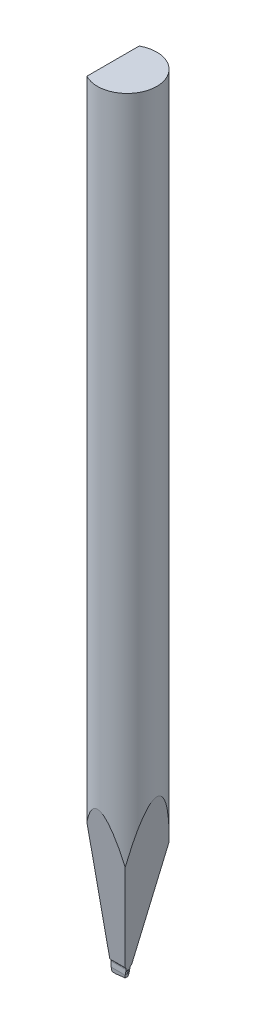
ISO-10303-21;
HEADER;
FILE_DESCRIPTION(('STEP AP214'),'2;1');
FILE_NAME('part.step','',(''),(''),'','','');
FILE_SCHEMA(('AUTOMOTIVE_DESIGN { 1 0 10303 214 1 1 1 1 }'));
ENDSEC;
DATA;
#1=APPLICATION_CONTEXT('core data for automotive mechanical design processes');
#2=APPLICATION_PROTOCOL_DEFINITION('international standard','automotive_design',2000,#1);
#3=PRODUCT_CONTEXT('',#1,'mechanical');
#4=PRODUCT('Part','Part','',(#3));
#5=PRODUCT_RELATED_PRODUCT_CATEGORY('part','',(#4));
#6=PRODUCT_DEFINITION_FORMATION('','',#4);
#7=PRODUCT_DEFINITION_CONTEXT('part definition',#1,'design');
#8=PRODUCT_DEFINITION('design','',#6,#7);
#9=PRODUCT_DEFINITION_SHAPE('','',#8);
#10=(LENGTH_UNIT() NAMED_UNIT(*) SI_UNIT(.MILLI.,.METRE.));
#11=(NAMED_UNIT(*) PLANE_ANGLE_UNIT() SI_UNIT($,.RADIAN.));
#12=(NAMED_UNIT(*) SI_UNIT($,.STERADIAN.) SOLID_ANGLE_UNIT());
#13=UNCERTAINTY_MEASURE_WITH_UNIT(LENGTH_MEASURE(1.E-05),#10,'distance_accuracy_value','');
#14=(GEOMETRIC_REPRESENTATION_CONTEXT(3) GLOBAL_UNCERTAINTY_ASSIGNED_CONTEXT((#13)) GLOBAL_UNIT_ASSIGNED_CONTEXT((#10,
#11,#12)) REPRESENTATION_CONTEXT('',''));
#15=CARTESIAN_POINT('',(0.,0.,0.));
#16=DIRECTION('',(0.,0.,1.));
#17=DIRECTION('',(1.,0.,0.));
#18=AXIS2_PLACEMENT_3D('',#15,#16,#17);
#19=CARTESIAN_POINT('',(26.8738719491216,0.,0.03048));
#20=DIRECTION('',(0.,-0.173648177666931,0.984807753012208));
#21=DIRECTION('',(0.,-0.984807753012208,-0.173648177666931));
#22=AXIS2_PLACEMENT_3D('',#19,#20,#21);
#23=PLANE('',#22);
#24=CARTESIAN_POINT('',(-0.34798,0.02794,0.0354065758409947));
#25=DIRECTION('',(0.,-0.173648177666931,0.984807753012208));
#26=DIRECTION('',(0.,-0.984807753012208,-0.173648177666931));
#27=AXIS2_PLACEMENT_3D('',#24,#25,#26);
#28=ELLIPSE('',#27,0.0283710195360877,0.02794);
#29=CARTESIAN_POINT('',(-0.352440322188275,0.000358319014665188,0.0305431813099863));
#30=VERTEX_POINT('',#29);
#31=CARTESIAN_POINT('',(-0.37592,0.02794,0.0354065758409947));
#32=VERTEX_POINT('',#31);
#33=EDGE_CURVE('E231',#30,#32,#28,.F.);
#34=ORIENTED_EDGE('',*,*,#33,.F.);
#35=DIRECTION('',(-1.,0.,0.));
#36=VECTOR('',#35,1.);
#37=CARTESIAN_POINT('',(26.7468719491216,0.000358319014665188,0.0305431813099863));
#38=LINE('',#37,#36);
#39=CARTESIAN_POINT('',(-0.27177042773209,0.000358319014666895,0.0305431813099866));
#40=VERTEX_POINT('',#39);
#41=EDGE_CURVE('E230',#40,#30,#38,.T.);
#42=ORIENTED_EDGE('',*,*,#41,.F.);
#43=DIRECTION('',(-0.98997002855162,-0.139131214142995,-0.0245325869121374));
#44=VECTOR('',#43,1.);
#45=CARTESIAN_POINT('',(26.3320118858664,3.73927609160853,0.689815263268684));
#46=LINE('',#45,#44);
#47=CARTESIAN_POINT('',(-0.0138656438636747,0.0366044726132731,0.0369343561363241));
#48=VERTEX_POINT('',#47);
#49=EDGE_CURVE('E390',#48,#40,#46,.T.);
#50=ORIENTED_EDGE('',*,*,#49,.F.);
#51=DIRECTION('',(-0.171087869746036,-0.970287525247814,-0.171087869746036));
#52=VECTOR('',#51,1.);
#53=CARTESIAN_POINT('',(0.766901483986015,4.46455489014234,0.817701483986016));
#54=LINE('',#53,#52);
#55=CARTESIAN_POINT('',(0.,0.115240446574631,0.0508));
#56=VERTEX_POINT('',#55);
#57=EDGE_CURVE('E377',#56,#48,#54,.T.);
#58=ORIENTED_EDGE('',*,*,#57,.F.);
#59=DIRECTION('',(-1.,0.,0.));
#60=VECTOR('',#59,1.);
#61=CARTESIAN_POINT('',(26.8738719491216,0.115240446574631,0.0508));
#62=LINE('',#61,#60);
#63=CARTESIAN_POINT('',(-0.375919999999998,0.115240446574631,0.0508));
#64=VERTEX_POINT('',#63);
#65=EDGE_CURVE('E284',#56,#64,#62,.T.);
#66=ORIENTED_EDGE('',*,*,#65,.T.);
#67=DIRECTION('',(0.,0.984807753012208,0.173648177666931));
#68=VECTOR('',#67,1.);
#69=CARTESIAN_POINT('',(-0.37592,20.2545871772642,3.60191020246341));
#70=LINE('',#69,#68);
#71=EDGE_CURVE('E54',#32,#64,#70,.T.);
#72=ORIENTED_EDGE('',*,*,#71,.F.);
#73=EDGE_LOOP('',(#34,#42,#50,#58,#66,#72));
#74=FACE_BOUND('',#73,.T.);
#75=ADVANCED_FACE('F46',(#74),#23,.T.);
#76=CARTESIAN_POINT('',(26.8738719491216,0.,-0.03048));
#77=DIRECTION('',(0.,-0.173648177666931,-0.984807753012208));
#78=DIRECTION('',(0.,0.984807753012208,-0.173648177666931));
#79=AXIS2_PLACEMENT_3D('',#76,#77,#78);
#80=PLANE('',#79);
#81=CARTESIAN_POINT('',(-0.34798,0.02794,-0.0354065758409947));
#82=DIRECTION('',(0.,-0.173648177666931,-0.984807753012208));
#83=DIRECTION('',(0.,0.984807753012208,-0.173648177666931));
#84=AXIS2_PLACEMENT_3D('',#81,#82,#83);
#85=ELLIPSE('',#84,0.0283710195360877,0.02794);
#86=CARTESIAN_POINT('',(-0.37592,0.02794,-0.0354065758409947));
#87=VERTEX_POINT('',#86);
#88=CARTESIAN_POINT('',(-0.352440322188275,0.000358319014665188,-0.0305431813099863));
#89=VERTEX_POINT('',#88);
#90=EDGE_CURVE('E609',#87,#89,#85,.F.);
#91=ORIENTED_EDGE('',*,*,#90,.F.);
#92=DIRECTION('',(0.,-0.984807753012208,0.173648177666931));
#93=VECTOR('',#92,1.);
#94=CARTESIAN_POINT('',(-0.37592,20.5290514950398,-3.65030566692899));
#95=LINE('',#94,#93);
#96=CARTESIAN_POINT('',(-0.375919999999998,0.115240446574631,-0.0508));
#97=VERTEX_POINT('',#96);
#98=EDGE_CURVE('E264',#97,#87,#95,.T.);
#99=ORIENTED_EDGE('',*,*,#98,.F.);
#100=DIRECTION('',(1.,0.,0.));
#101=VECTOR('',#100,1.);
#102=CARTESIAN_POINT('',(26.8738719491216,0.115240446574631,-0.0508));
#103=LINE('',#102,#101);
#104=CARTESIAN_POINT('',(0.,0.115240446574631,-0.0508));
#105=VERTEX_POINT('',#104);
#106=EDGE_CURVE('E273',#97,#105,#103,.T.);
#107=ORIENTED_EDGE('',*,*,#106,.T.);
#108=DIRECTION('',(0.171087869746036,0.970287525247814,-0.171087869746036));
#109=VECTOR('',#108,1.);
#110=CARTESIAN_POINT('',(0.766901483986015,4.46455489014234,-0.817701483986016));
#111=LINE('',#110,#109);
#112=CARTESIAN_POINT('',(-0.0138656438636747,0.0366044726132731,-0.0369343561363241));
#113=VERTEX_POINT('',#112);
#114=EDGE_CURVE('E388',#113,#105,#111,.T.);
#115=ORIENTED_EDGE('',*,*,#114,.F.);
#116=DIRECTION('',(0.98997002855162,0.139131214142995,-0.0245325869121374));
#117=VECTOR('',#116,1.);
#118=CARTESIAN_POINT('',(26.3320118858664,3.73927609160853,-0.689815263268684));
#119=LINE('',#118,#117);
#120=CARTESIAN_POINT('',(-0.27177042773209,0.000358319014666895,-0.0305431813099866));
#121=VERTEX_POINT('',#120);
#122=EDGE_CURVE('E296',#121,#113,#119,.T.);
#123=ORIENTED_EDGE('',*,*,#122,.F.);
#124=DIRECTION('',(-1.,0.,0.));
#125=VECTOR('',#124,1.);
#126=CARTESIAN_POINT('',(26.7468719491216,0.000358319014665188,-0.0305431813099863));
#127=LINE('',#126,#125);
#128=EDGE_CURVE('E256',#89,#121,#127,.F.);
#129=ORIENTED_EDGE('',*,*,#128,.F.);
#130=EDGE_LOOP('',(#91,#99,#107,#115,#123,#129));
#131=FACE_BOUND('',#130,.T.);
#132=ADVANCED_FACE('F471',(#131),#80,.T.);
#133=CARTESIAN_POINT('',(-0.27432,0.,26.5130490073722));
#134=DIRECTION('',(-0.139173100960066,0.99026806874157,0.));
#135=DIRECTION('',(-0.99026806874157,-0.139173100960066,0.));
#136=AXIS2_PLACEMENT_3D('',#133,#134,#135);
#137=PLANE('',#136);
#138=DIRECTION('',(-0.99026806874157,-0.139173100960066,0.));
#139=VECTOR('',#138,1.);
#140=CARTESIAN_POINT('',(-0.27432,0.,0.0190499999999996));
#141=LINE('',#140,#139);
#142=CARTESIAN_POINT('',(-0.13716,0.0192765808877801,0.0190499999999998));
#143=VERTEX_POINT('',#142);
#144=CARTESIAN_POINT('',(-0.261173150528052,0.00184766919849458,0.01905));
#145=VERTEX_POINT('',#144);
#146=EDGE_CURVE('E305',#143,#145,#141,.T.);
#147=ORIENTED_EDGE('',*,*,#146,.F.);
#148=DIRECTION('',(0.,0.,1.));
#149=VECTOR('',#148,1.);
#150=CARTESIAN_POINT('',(-0.13716,0.0192765808877801,26.5130490073722));
#151=LINE('',#150,#149);
#152=CARTESIAN_POINT('',(-0.13716,0.0192765808877801,-0.0190499999999998));
#153=VERTEX_POINT('',#152);
#154=EDGE_CURVE('E306',#153,#143,#151,.T.);
#155=ORIENTED_EDGE('',*,*,#154,.F.);
#156=DIRECTION('',(-0.99026806874157,-0.139173100960066,0.));
#157=VECTOR('',#156,1.);
#158=CARTESIAN_POINT('',(-0.27432,0.,-0.0190499999999996));
#159=LINE('',#158,#157);
#160=CARTESIAN_POINT('',(-0.261173150528052,0.00184766919849458,-0.01905));
#161=VERTEX_POINT('',#160);
#162=EDGE_CURVE('E636',#153,#161,#159,.T.);
#163=ORIENTED_EDGE('',*,*,#162,.T.);
#164=CARTESIAN_POINT('',(-1.62801954506725,-0.190250064,0.));
#165=DIRECTION('',(-0.139173100960066,0.99026806874157,0.));
#166=DIRECTION('',(-0.99026806874157,-0.139173100960066,0.));
#167=AXIS2_PLACEMENT_3D('',#164,#165,#166);
#168=ELLIPSE('',#167,1.38704964298662,0.19304);
#169=EDGE_CURVE('E298',#161,#121,#168,.T.);
#170=ORIENTED_EDGE('',*,*,#169,.T.);
#171=ORIENTED_EDGE('',*,*,#122,.T.);
#172=DIRECTION('',(0.,0.,-1.));
#173=VECTOR('',#172,1.);
#174=CARTESIAN_POINT('',(-0.0138656438636759,0.036604472613273,26.5130490073722));
#175=LINE('',#174,#173);
#176=EDGE_CURVE('E353',#48,#113,#175,.T.);
#177=ORIENTED_EDGE('',*,*,#176,.F.);
#178=ORIENTED_EDGE('',*,*,#49,.T.);
#179=EDGE_CURVE('E299',#40,#145,#168,.T.);
#180=ORIENTED_EDGE('',*,*,#179,.T.);
#181=EDGE_LOOP('',(#147,#155,#163,#170,#171,#177,#178,#180));
#182=FACE_BOUND('',#181,.T.);
#183=ADVANCED_FACE('F332',(#182),#137,.F.);
#184=CARTESIAN_POINT('',(26.7468719491216,-0.190250064,0.));
#185=DIRECTION('',(-1.,0.,0.));
#186=DIRECTION('',(0.,0.,1.));
#187=AXIS2_PLACEMENT_3D('',#184,#185,#186);
#188=CYLINDRICAL_SURFACE('',#187,0.19304);
#189=ORIENTED_EDGE('',*,*,#41,.T.);
#190=CARTESIAN_POINT('',(-0.352440322188276,0.000358319014665188,0.0305431813099863));
#191=CARTESIAN_POINT('',(-0.353255837046404,0.000494975038074909,0.0296944233819826));
#192=CARTESIAN_POINT('',(-0.353947767494821,0.000638912278501625,0.0287562200174742));
#193=CARTESIAN_POINT('',(-0.355141453205388,0.000925379711895768,0.0267824850546507));
#194=CARTESIAN_POINT('',(-0.355645961010493,0.00106789765251043,0.0257486658105394));
#195=CARTESIAN_POINT('',(-0.35697957695198,0.00147340894449478,0.022605687875244));
#196=CARTESIAN_POINT('',(-0.35764607766537,0.00171850529716905,0.0204301272540014));
#197=CARTESIAN_POINT('',(-0.358718736120378,0.00214017910068697,0.0159851389712847));
#198=CARTESIAN_POINT('',(-0.359121328191851,0.00231580588562661,0.0137148496339273));
#199=CARTESIAN_POINT('',(-0.360020761463999,0.00271817708588604,0.00692716075438165));
#200=CARTESIAN_POINT('',(-0.36023052833373,0.00282938608257906,0.00236522832354541));
#201=CARTESIAN_POINT('',(-0.360019162978674,0.00272581874417298,-0.00672953623834699));
#202=CARTESIAN_POINT('',(-0.359600341115064,0.00251223613390703,-0.0112624137386527));
#203=CARTESIAN_POINT('',(-0.358422999055823,0.00202335363268295,-0.0172586727124464));
#204=CARTESIAN_POINT('',(-0.35805997925171,0.00187754313005197,-0.0188092679120086));
#205=CARTESIAN_POINT('',(-0.357183231856094,0.00155503464098162,-0.0218532951177932));
#206=CARTESIAN_POINT('',(-0.356670608464873,0.00137856666358884,-0.0233470583798732));
#207=CARTESIAN_POINT('',(-0.355604736688645,0.00105611706681335,-0.0258351570460472));
#208=CARTESIAN_POINT('',(-0.355104197285118,0.000915673824416879,-0.0268510324690974));
#209=CARTESIAN_POINT('',(-0.353923861620095,0.000633868812659255,-0.0287890402047738));
#210=CARTESIAN_POINT('',(-0.353241678457768,0.000492521265612302,-0.0297096791542224));
#211=CARTESIAN_POINT('',(-0.352440322195877,0.000358319014198527,-0.0305431813131893));
#212=B_SPLINE_CURVE_WITH_KNOTS('',3,(#190,#191,#192,#193,#194,#195,#196,#197,#198,#199,#200,
#201,#202,#203,#204,#205,#206,#207,#208,#209,#210,#211),.UNSPECIFIED.,.F.,.F.,(4,2,2,2,2,2,2,2,
2,2,4),(0.,0.00351631730309753,0.00697873430758846,0.0138143538773105,0.0207405236023784,
0.0343820224874692,0.0479735050425407,0.052765241694841,0.0575224690773116,0.0609311503009114,
0.0643870460477088),.UNSPECIFIED.);
#213=CARTESIAN_POINT('',(-0.358707646430783,0.00215912973029136,0.0155887119086305));
#214=VERTEX_POINT('',#213);
#215=EDGE_CURVE('E227',#30,#214,#212,.T.);
#216=ORIENTED_EDGE('',*,*,#215,.T.);
#217=CARTESIAN_POINT('',(-0.37592,0.000358319014665188,-0.0305431813099864));
#218=CARTESIAN_POINT('',(-0.363216633412438,0.00197528255523886,-0.0204523265711041));
#219=CARTESIAN_POINT('',(-0.35052,0.002789936,-0.0102236138317165));
#220=CARTESIAN_POINT('',(-0.35052,0.00278993600000001,0.0102236138317165));
#221=CARTESIAN_POINT('',(-0.363216633412438,0.00197528255523886,0.020452326571104));
#222=CARTESIAN_POINT('',(-0.37592,0.000358319014665188,0.0305431813099863));
#223=(BOUNDED_CURVE() B_SPLINE_CURVE(3,(#217,#218,#219,#220,#221,#222),.UNSPECIFIED.,.F.,
.F.) B_SPLINE_CURVE_WITH_KNOTS((4,2,4),(1.41190658312137,1.5707963267949,1.72968607046842),
.UNSPECIFIED.) CURVE() GEOMETRIC_REPRESENTATION_ITEM() RATIONAL_B_SPLINE_CURVE((1.,1.,1.,1.,1.,1.)) REPRESENTATION_ITEM(''));
#224=CARTESIAN_POINT('',(-0.358742735480046,0.00215626217494993,-0.0156255438613643));
#225=VERTEX_POINT('',#224);
#226=EDGE_CURVE('E216',#214,#225,#223,.F.);
#227=ORIENTED_EDGE('',*,*,#226,.T.);
#228=EDGE_CURVE('E612',#225,#89,#212,.T.);
#229=ORIENTED_EDGE('',*,*,#228,.T.);
#230=ORIENTED_EDGE('',*,*,#128,.T.);
#231=ORIENTED_EDGE('',*,*,#169,.F.);
#232=DIRECTION('',(-1.,0.,0.));
#233=VECTOR('',#232,1.);
#234=CARTESIAN_POINT('',(26.7468719491216,0.00184766919849458,-0.01905));
#235=LINE('',#234,#233);
#236=CARTESIAN_POINT('',(-0.274474497104347,0.00184766919849559,-0.01905));
#237=VERTEX_POINT('',#236);
#238=EDGE_CURVE('E302',#161,#237,#235,.T.);
#239=ORIENTED_EDGE('',*,*,#238,.T.);
#240=CARTESIAN_POINT('',(-0.274474497105635,0.00184766919849458,0.01905));
#241=CARTESIAN_POINT('',(-0.280018627175443,0.00128682425279346,0.0247054878081374));
#242=CARTESIAN_POINT('',(-0.288752439638852,0.00114605221158905,0.0254071015619594));
#243=CARTESIAN_POINT('',(-0.304000178477763,0.00197558816315365,0.0180912343722049));
#244=CARTESIAN_POINT('',(-0.310314344552846,0.00279529276545693,0.00923260833826843));
#245=CARTESIAN_POINT('',(-0.310248473666769,0.00278451502753157,-0.00945526969970111));
#246=CARTESIAN_POINT('',(-0.303937650069013,0.00196585516744033,-0.0181925451420976));
#247=CARTESIAN_POINT('',(-0.288616261346002,0.00113482769866668,-0.0254902238048416));
#248=CARTESIAN_POINT('',(-0.279987740881263,0.0012890087923044,-0.024683459194587));
#249=CARTESIAN_POINT('',(-0.274474497104348,0.00184766919849458,-0.01905));
#250=(BOUNDED_CURVE() B_SPLINE_CURVE(3,(#240,#241,#242,#243,#244,#245,#246,#247,#248,#249),
.UNSPECIFIED.,.F.,.F.) B_SPLINE_CURVE_WITH_KNOTS((4,2,2,2,4),(0.,1.64982251643939E-05,
3.2996450328787E-05,4.949467549318E-05,6.59929006575731E-05),
.UNSPECIFIED.) CURVE() GEOMETRIC_REPRESENTATION_ITEM() RATIONAL_B_SPLINE_CURVE((1.,1.,1.,1.,1.,
1.,1.,1.,1.,1.)) REPRESENTATION_ITEM(''));
#251=CARTESIAN_POINT('',(-0.27447449710435,0.00184766919849356,0.01905));
#252=VERTEX_POINT('',#251);
#253=EDGE_CURVE('E308',#237,#252,#250,.F.);
#254=ORIENTED_EDGE('',*,*,#253,.T.);
#255=DIRECTION('',(-1.,0.,0.));
#256=VECTOR('',#255,1.);
#257=CARTESIAN_POINT('',(26.7468719491216,0.00184766919849458,0.01905));
#258=LINE('',#257,#256);
#259=EDGE_CURVE('E309',#145,#252,#258,.T.);
#260=ORIENTED_EDGE('',*,*,#259,.F.);
#261=ORIENTED_EDGE('',*,*,#179,.F.);
#262=EDGE_LOOP('',(#189,#216,#227,#229,#230,#231,#239,#254,#260,#261));
#263=FACE_BOUND('',#262,.T.);
#264=ADVANCED_FACE('F228',(#263),#188,.F.);
#265=CARTESIAN_POINT('',(0.,21.0312,0.));
#266=DIRECTION('',(0.,-1.,0.));
#267=DIRECTION('',(0.,0.,-1.));
#268=AXIS2_PLACEMENT_3D('',#265,#266,#267);
#269=CYLINDRICAL_SURFACE('',#268,0.792479999999998);
#270=CARTESIAN_POINT('',(0.,-0.172860669861948,0.));
#271=DIRECTION('',(0.,-0.173648177666931,0.984807753012208));
#272=DIRECTION('',(0.,-0.984807753012208,-0.173648177666931));
#273=AXIS2_PLACEMENT_3D('',#270,#271,#272);
#274=ELLIPSE('',#273,4.56371043248163,0.792479999999998);
#275=CARTESIAN_POINT('',(0.534392028524878,3.14592824249639,0.585192028524879));
#276=VERTEX_POINT('',#275);
#277=CARTESIAN_POINT('',(-0.37592,3.78368137728878,0.69764511322018));
#278=VERTEX_POINT('',#277);
#279=EDGE_CURVE('E413',#276,#278,#274,.T.);
#280=ORIENTED_EDGE('',*,*,#279,.F.);
#281=CARTESIAN_POINT('',(0.,0.115240446574634,0.));
#282=DIRECTION('',(-0.984807753012208,0.173648177666931,0.));
#283=DIRECTION('',(-0.173648177666931,-0.984807753012208,0.));
#284=AXIS2_PLACEMENT_3D('',#281,#282,#283);
#285=ELLIPSE('',#284,4.56371043248165,0.792479999999998);
#286=CARTESIAN_POINT('',(0.534392028524878,3.14592824249639,-0.585192028524879));
#287=VERTEX_POINT('',#286);
#288=EDGE_CURVE('E369',#276,#287,#285,.T.);
#289=ORIENTED_EDGE('',*,*,#288,.T.);
#290=CARTESIAN_POINT('',(0.,-0.172860669861948,0.));
#291=DIRECTION('',(0.,-0.173648177666931,-0.984807753012208));
#292=DIRECTION('',(0.,-0.984807753012208,0.173648177666931));
#293=AXIS2_PLACEMENT_3D('',#290,#291,#292);
#294=ELLIPSE('',#293,4.56371043248163,0.792479999999998);
#295=CARTESIAN_POINT('',(-0.37592,3.78368137728877,-0.69764511322018));
#296=VERTEX_POINT('',#295);
#297=EDGE_CURVE('E415',#296,#287,#294,.T.);
#298=ORIENTED_EDGE('',*,*,#297,.F.);
#299=DIRECTION('',(0.,-1.,0.));
#300=VECTOR('',#299,1.);
#301=CARTESIAN_POINT('',(-0.37592,21.0312,-0.69764511322018));
#302=LINE('',#301,#300);
#303=CARTESIAN_POINT('',(-0.37592,21.0312,-0.69764511322018));
#304=VERTEX_POINT('',#303);
#305=EDGE_CURVE('E422',#304,#296,#302,.T.);
#306=ORIENTED_EDGE('',*,*,#305,.F.);
#307=CARTESIAN_POINT('',(0.,21.0312,0.));
#308=DIRECTION('',(0.,1.,0.));
#309=DIRECTION('',(0.,0.,1.));
#310=AXIS2_PLACEMENT_3D('',#307,#308,#309);
#311=CIRCLE('',#310,0.792479999999998);
#312=CARTESIAN_POINT('',(-0.37592,21.0312,0.69764511322018));
#313=VERTEX_POINT('',#312);
#314=EDGE_CURVE('E424',#313,#304,#311,.T.);
#315=ORIENTED_EDGE('',*,*,#314,.F.);
#316=DIRECTION('',(0.,-1.,0.));
#317=VECTOR('',#316,1.);
#318=CARTESIAN_POINT('',(-0.37592,21.0312,0.69764511322018));
#319=LINE('',#318,#317);
#320=EDGE_CURVE('E420',#278,#313,#319,.F.);
#321=ORIENTED_EDGE('',*,*,#320,.F.);
#322=EDGE_LOOP('',(#280,#289,#298,#306,#315,#321));
#323=FACE_BOUND('',#322,.T.);
#324=ADVANCED_FACE('F331',(#323),#269,.T.);
#325=CARTESIAN_POINT('',(-0.37592,21.0312,-0.80247998));
#326=DIRECTION('',(-1.,0.,0.));
#327=DIRECTION('',(0.,0.,1.));
#328=AXIS2_PLACEMENT_3D('',#325,#326,#327);
#329=PLANE('',#328);
#330=DIRECTION('',(0.,0.,-1.));
#331=VECTOR('',#330,1.);
#332=CARTESIAN_POINT('',(-0.37592,0.02794,26.4339076635059));
#333=LINE('',#332,#331);
#334=CARTESIAN_POINT('',(-0.37592,0.02794,0.00054966080732713));
#335=VERTEX_POINT('',#334);
#336=EDGE_CURVE('E68',#32,#335,#333,.T.);
#337=ORIENTED_EDGE('',*,*,#336,.F.);
#338=ORIENTED_EDGE('',*,*,#71,.T.);
#339=DIRECTION('',(0.,1.,0.));
#340=VECTOR('',#339,1.);
#341=CARTESIAN_POINT('',(-0.37592,21.0312,0.0508));
#342=LINE('',#341,#340);
#343=CARTESIAN_POINT('',(-0.375919999999998,0.254,0.0508));
#344=VERTEX_POINT('',#343);
#345=EDGE_CURVE('E410',#64,#344,#342,.T.);
#346=ORIENTED_EDGE('',*,*,#345,.T.);
#347=CARTESIAN_POINT('',(-0.375919999999998,0.254,0.127));
#348=DIRECTION('',(-1.,0.,0.));
#349=DIRECTION('',(0.,0.,1.));
#350=AXIS2_PLACEMENT_3D('',#347,#348,#349);
#351=CIRCLE('',#350,0.0762);
#352=CARTESIAN_POINT('',(-0.375919999999998,0.307881536726415,0.0731184632735852));
#353=VERTEX_POINT('',#352);
#354=EDGE_CURVE('E287',#344,#353,#351,.F.);
#355=ORIENTED_EDGE('',*,*,#354,.T.);
#356=DIRECTION('',(0.,0.707106781186546,0.707106781186549));
#357=VECTOR('',#356,1.);
#358=CARTESIAN_POINT('',(-0.37592,10.2317415467264,9.99697847327358));
#359=LINE('',#358,#357);
#360=CARTESIAN_POINT('',(-0.375919999999998,0.322024720053321,0.0872616466004911));
#361=VERTEX_POINT('',#360);
#362=EDGE_CURVE('E407',#353,#361,#359,.T.);
#363=ORIENTED_EDGE('',*,*,#362,.T.);
#364=EDGE_CURVE('E274',#361,#278,#70,.T.);
#365=ORIENTED_EDGE('',*,*,#364,.T.);
#366=ORIENTED_EDGE('',*,*,#320,.T.);
#367=DIRECTION('',(0.,0.,-1.));
#368=VECTOR('',#367,1.);
#369=CARTESIAN_POINT('',(-0.37592,21.0312,-0.80247998));
#370=LINE('',#369,#368);
#371=EDGE_CURVE('E418',#313,#304,#370,.T.);
#372=ORIENTED_EDGE('',*,*,#371,.T.);
#373=ORIENTED_EDGE('',*,*,#305,.T.);
#374=CARTESIAN_POINT('',(-0.375919999999998,0.322024720053321,-0.0872616466004911));
#375=VERTEX_POINT('',#374);
#376=EDGE_CURVE('E267',#296,#375,#95,.T.);
#377=ORIENTED_EDGE('',*,*,#376,.T.);
#378=DIRECTION('',(0.,-0.707106781186546,0.707106781186549));
#379=VECTOR('',#378,1.);
#380=CARTESIAN_POINT('',(-0.37592,11.0342215267264,-10.7994584532736));
#381=LINE('',#380,#379);
#382=CARTESIAN_POINT('',(-0.375919999999998,0.307881536726415,-0.0731184632735852));
#383=VERTEX_POINT('',#382);
#384=EDGE_CURVE('E404',#375,#383,#381,.T.);
#385=ORIENTED_EDGE('',*,*,#384,.T.);
#386=CARTESIAN_POINT('',(-0.375919999999998,0.254,-0.127));
#387=DIRECTION('',(-1.,0.,0.));
#388=DIRECTION('',(0.,0.,1.));
#389=AXIS2_PLACEMENT_3D('',#386,#387,#388);
#390=CIRCLE('',#389,0.0762);
#391=CARTESIAN_POINT('',(-0.375919999999998,0.254,-0.0508));
#392=VERTEX_POINT('',#391);
#393=EDGE_CURVE('E290',#383,#392,#390,.F.);
#394=ORIENTED_EDGE('',*,*,#393,.T.);
#395=DIRECTION('',(0.,-1.,0.));
#396=VECTOR('',#395,1.);
#397=CARTESIAN_POINT('',(-0.37592,21.0312,-0.0508));
#398=LINE('',#397,#396);
#399=EDGE_CURVE('E401',#392,#97,#398,.T.);
#400=ORIENTED_EDGE('',*,*,#399,.T.);
#401=ORIENTED_EDGE('',*,*,#98,.T.);
#402=EDGE_CURVE('E621',#335,#87,#333,.T.);
#403=ORIENTED_EDGE('',*,*,#402,.F.);
#404=EDGE_LOOP('',(#337,#338,#346,#355,#363,#365,#366,#372,#373,#377,#385,#394,#400,#401,#403));
#405=FACE_BOUND('',#404,.T.);
#406=ADVANCED_FACE('F432',(#405),#329,.T.);
#407=DIRECTION('',(-0.171087869746036,-0.970287525247814,-0.171087869746036));
#408=VECTOR('',#407,1.);
#409=CARTESIAN_POINT('',(0.766901483986015,4.46455489014234,0.817701483986016));
#410=LINE('',#409,#408);
#411=CARTESIAN_POINT('',(0.0364616466004962,0.322024720053321,0.0872616466004912));
#412=VERTEX_POINT('',#411);
#413=EDGE_CURVE('E362',#276,#412,#410,.T.);
#414=ORIENTED_EDGE('',*,*,#413,.F.);
#415=ORIENTED_EDGE('',*,*,#279,.T.);
#416=ORIENTED_EDGE('',*,*,#364,.F.);
#417=DIRECTION('',(1.,0.,0.));
#418=VECTOR('',#417,1.);
#419=CARTESIAN_POINT('',(26.8738719491216,0.322024720053321,0.0872616466004911));
#420=LINE('',#419,#418);
#421=EDGE_CURVE('E281',#361,#412,#420,.T.);
#422=ORIENTED_EDGE('',*,*,#421,.T.);
#423=EDGE_LOOP('',(#414,#415,#416,#422));
#424=FACE_BOUND('',#423,.T.);
#425=ADVANCED_FACE('F446',(#424),#23,.T.);
#426=DIRECTION('',(0.171087869746036,0.970287525247814,-0.171087869746036));
#427=VECTOR('',#426,1.);
#428=CARTESIAN_POINT('',(0.766901483986015,4.46455489014234,-0.817701483986016));
#429=LINE('',#428,#427);
#430=CARTESIAN_POINT('',(0.0364616466004962,0.322024720053321,-0.0872616466004912));
#431=VERTEX_POINT('',#430);
#432=EDGE_CURVE('E374',#431,#287,#429,.T.);
#433=ORIENTED_EDGE('',*,*,#432,.F.);
#434=DIRECTION('',(-1.,0.,0.));
#435=VECTOR('',#434,1.);
#436=CARTESIAN_POINT('',(26.8738719491216,0.322024720053321,-0.0872616466004911));
#437=LINE('',#436,#435);
#438=EDGE_CURVE('E279',#431,#375,#437,.T.);
#439=ORIENTED_EDGE('',*,*,#438,.T.);
#440=ORIENTED_EDGE('',*,*,#376,.F.);
#441=ORIENTED_EDGE('',*,*,#297,.T.);
#442=EDGE_LOOP('',(#433,#439,#440,#441));
#443=FACE_BOUND('',#442,.T.);
#444=ADVANCED_FACE('F453',(#443),#80,.T.);
#445=CARTESIAN_POINT('',(0.,21.0312,0.));
#446=DIRECTION('',(0.,1.,0.));
#447=DIRECTION('',(0.,0.,1.));
#448=AXIS2_PLACEMENT_3D('',#445,#446,#447);
#449=PLANE('',#448);
#450=ORIENTED_EDGE('',*,*,#314,.T.);
#451=ORIENTED_EDGE('',*,*,#371,.F.);
#452=EDGE_LOOP('',(#450,#451));
#453=FACE_BOUND('',#452,.T.);
#454=ADVANCED_FACE('F460',(#453),#449,.T.);
#455=CARTESIAN_POINT('',(26.8738719491216,0.,-0.0508));
#456=DIRECTION('',(0.,0.,-1.));
#457=DIRECTION('',(-1.,0.,0.));
#458=AXIS2_PLACEMENT_3D('',#455,#456,#457);
#459=PLANE('',#458);
#460=DIRECTION('',(0.173648177666931,0.984807753012208,0.));
#461=VECTOR('',#460,1.);
#462=CARTESIAN_POINT('',(0.790639116266124,4.59917769253332,-0.0508));
#463=LINE('',#462,#461);
#464=CARTESIAN_POINT('',(0.0244670530999518,0.254,-0.0508));
#465=VERTEX_POINT('',#464);
#466=EDGE_CURVE('E385',#105,#465,#463,.T.);
#467=ORIENTED_EDGE('',*,*,#466,.F.);
#468=ORIENTED_EDGE('',*,*,#106,.F.);
#469=ORIENTED_EDGE('',*,*,#399,.F.);
#470=DIRECTION('',(-1.,0.,0.));
#471=VECTOR('',#470,1.);
#472=CARTESIAN_POINT('',(26.8738719491216,0.254,-0.0508));
#473=LINE('',#472,#471);
#474=EDGE_CURVE('E397',#465,#392,#473,.T.);
#475=ORIENTED_EDGE('',*,*,#474,.F.);
#476=EDGE_LOOP('',(#467,#468,#469,#475));
#477=FACE_BOUND('',#476,.T.);
#478=ADVANCED_FACE('F462',(#477),#459,.T.);
#479=CARTESIAN_POINT('',(26.8738719491216,0.307881536726415,-0.0731184632735852));
#480=DIRECTION('',(0.,-0.707106781186549,-0.707106781186546));
#481=DIRECTION('',(0.,0.707106781186546,-0.707106781186549));
#482=AXIS2_PLACEMENT_3D('',#479,#480,#481);
#483=PLANE('',#482);
#484=DIRECTION('',(0.123724030206484,0.701673843159862,-0.701673843159865));
#485=VECTOR('',#484,1.);
#486=CARTESIAN_POINT('',(0.44482329506338,2.63795871281001,-2.40319563935719));
#487=LINE('',#486,#485);
#488=CARTESIAN_POINT('',(0.0339678217868532,0.307881536726415,-0.0731184632735852));
#489=VERTEX_POINT('',#488);
#490=EDGE_CURVE('E379',#489,#431,#487,.T.);
#491=ORIENTED_EDGE('',*,*,#490,.F.);
#492=DIRECTION('',(-1.,0.,0.));
#493=VECTOR('',#492,1.);
#494=CARTESIAN_POINT('',(26.8738719491216,0.307881536726415,-0.0731184632735852));
#495=LINE('',#494,#493);
#496=EDGE_CURVE('E399',#489,#383,#495,.T.);
#497=ORIENTED_EDGE('',*,*,#496,.T.);
#498=ORIENTED_EDGE('',*,*,#384,.F.);
#499=ORIENTED_EDGE('',*,*,#438,.F.);
#500=EDGE_LOOP('',(#491,#497,#498,#499));
#501=FACE_BOUND('',#500,.T.);
#502=ADVANCED_FACE('F456',(#501),#483,.T.);
#503=CARTESIAN_POINT('',(26.8738719491216,0.254,-0.127));
#504=DIRECTION('',(-1.,0.,0.));
#505=DIRECTION('',(0.,0.,1.));
#506=AXIS2_PLACEMENT_3D('',#503,#504,#505);
#507=CYLINDRICAL_SURFACE('',#506,0.0762);
#508=CARTESIAN_POINT('',(0.0244670530999518,0.254,-0.127));
#509=DIRECTION('',(-0.984807753012208,0.173648177666931,0.));
#510=DIRECTION('',(-0.173648177666931,-0.984807753012208,0.));
#511=AXIS2_PLACEMENT_3D('',#508,#509,#510);
#512=ELLIPSE('',#511,0.0773755078256938,0.0762);
#513=EDGE_CURVE('E382',#465,#489,#512,.T.);
#514=ORIENTED_EDGE('',*,*,#513,.F.);
#515=ORIENTED_EDGE('',*,*,#474,.T.);
#516=ORIENTED_EDGE('',*,*,#393,.F.);
#517=ORIENTED_EDGE('',*,*,#496,.F.);
#518=EDGE_LOOP('',(#514,#515,#516,#517));
#519=FACE_BOUND('',#518,.T.);
#520=ADVANCED_FACE('F666',(#519),#507,.F.);
#521=CARTESIAN_POINT('',(26.8738719491216,0.254,0.127));
#522=DIRECTION('',(-1.,0.,0.));
#523=DIRECTION('',(0.,0.,1.));
#524=AXIS2_PLACEMENT_3D('',#521,#522,#523);
#525=CYLINDRICAL_SURFACE('',#524,0.0762);
#526=CARTESIAN_POINT('',(0.0244670530999518,0.254,0.127));
#527=DIRECTION('',(-0.984807753012208,0.173648177666931,0.));
#528=DIRECTION('',(-0.173648177666931,-0.984807753012208,0.));
#529=AXIS2_PLACEMENT_3D('',#526,#527,#528);
#530=ELLIPSE('',#529,0.0773755078256938,0.0762);
#531=CARTESIAN_POINT('',(0.0339678217868525,0.307881536726415,0.0731184632735858));
#532=VERTEX_POINT('',#531);
#533=CARTESIAN_POINT('',(0.0244670530999519,0.254,0.0508));
#534=VERTEX_POINT('',#533);
#535=EDGE_CURVE('E355',#532,#534,#530,.T.);
#536=ORIENTED_EDGE('',*,*,#535,.F.);
#537=DIRECTION('',(-1.,0.,0.));
#538=VECTOR('',#537,1.);
#539=CARTESIAN_POINT('',(26.8738719491216,0.307881536726415,0.0731184632735852));
#540=LINE('',#539,#538);
#541=EDGE_CURVE('E393',#532,#353,#540,.T.);
#542=ORIENTED_EDGE('',*,*,#541,.T.);
#543=ORIENTED_EDGE('',*,*,#354,.F.);
#544=DIRECTION('',(-1.,0.,0.));
#545=VECTOR('',#544,1.);
#546=CARTESIAN_POINT('',(26.8738719491216,0.254,0.0508));
#547=LINE('',#546,#545);
#548=EDGE_CURVE('E395',#534,#344,#547,.T.);
#549=ORIENTED_EDGE('',*,*,#548,.F.);
#550=EDGE_LOOP('',(#536,#542,#543,#549));
#551=FACE_BOUND('',#550,.T.);
#552=ADVANCED_FACE('F442',(#551),#525,.F.);
#553=CARTESIAN_POINT('',(26.8738719491216,0.,0.0508));
#554=DIRECTION('',(0.,0.,1.));
#555=DIRECTION('',(1.,0.,0.));
#556=AXIS2_PLACEMENT_3D('',#553,#554,#555);
#557=PLANE('',#556);
#558=DIRECTION('',(-0.173648177666931,-0.984807753012208,0.));
#559=VECTOR('',#558,1.);
#560=CARTESIAN_POINT('',(0.790639116266124,4.59917769253332,0.0508));
#561=LINE('',#560,#559);
#562=EDGE_CURVE('E371',#534,#56,#561,.T.);
#563=ORIENTED_EDGE('',*,*,#562,.F.);
#564=ORIENTED_EDGE('',*,*,#548,.T.);
#565=ORIENTED_EDGE('',*,*,#345,.F.);
#566=ORIENTED_EDGE('',*,*,#65,.F.);
#567=EDGE_LOOP('',(#563,#564,#565,#566));
#568=FACE_BOUND('',#567,.T.);
#569=ADVANCED_FACE('F437',(#568),#557,.T.);
#570=CARTESIAN_POINT('',(26.8738719491216,0.307881536726415,0.0731184632735852));
#571=DIRECTION('',(0.,-0.707106781186549,0.707106781186546));
#572=DIRECTION('',(0.,-0.707106781186546,-0.707106781186549));
#573=AXIS2_PLACEMENT_3D('',#570,#571,#572);
#574=PLANE('',#573);
#575=DIRECTION('',(-0.123724030206484,-0.701673843159862,-0.701673843159865));
#576=VECTOR('',#575,1.);
#577=CARTESIAN_POINT('',(0.44482329506338,2.63795871281001,2.40319563935719));
#578=LINE('',#577,#576);
#579=EDGE_CURVE('E293',#412,#532,#578,.T.);
#580=ORIENTED_EDGE('',*,*,#579,.F.);
#581=ORIENTED_EDGE('',*,*,#421,.F.);
#582=ORIENTED_EDGE('',*,*,#362,.F.);
#583=ORIENTED_EDGE('',*,*,#541,.F.);
#584=EDGE_LOOP('',(#580,#581,#582,#583));
#585=FACE_BOUND('',#584,.T.);
#586=ADVANCED_FACE('F654',(#585),#574,.T.);
#587=CARTESIAN_POINT('',(-0.0138656438636759,0.036604472613273,26.5130490073722));
#588=DIRECTION('',(-0.984807753012208,0.173648177666931,0.));
#589=DIRECTION('',(-0.173648177666931,-0.984807753012208,0.));
#590=AXIS2_PLACEMENT_3D('',#587,#588,#589);
#591=PLANE('',#590);
#592=CARTESIAN_POINT('',(0.00999712751934759,0.171936974123507,0.));
#593=DIRECTION('',(-0.984807753012208,0.173648177666931,0.));
#594=DIRECTION('',(0.173648177666931,0.984807753012208,0.));
#595=AXIS2_PLACEMENT_3D('',#592,#593,#594);
#596=ELLIPSE('',#595,0.0515734368592615,0.0370444608655554);
#597=CARTESIAN_POINT('',(0.0189527608459789,0.222726894591994,0.));
#598=VERTEX_POINT('',#597);
#599=EDGE_CURVE('E258',#598,#598,#596,.F.);
#600=ORIENTED_EDGE('',*,*,#599,.F.);
#601=EDGE_LOOP('',(#600));
#602=FACE_BOUND('',#601,.T.);
#603=ORIENTED_EDGE('',*,*,#176,.T.);
#604=ORIENTED_EDGE('',*,*,#114,.T.);
#605=ORIENTED_EDGE('',*,*,#466,.T.);
#606=ORIENTED_EDGE('',*,*,#513,.T.);
#607=ORIENTED_EDGE('',*,*,#490,.T.);
#608=ORIENTED_EDGE('',*,*,#432,.T.);
#609=ORIENTED_EDGE('',*,*,#288,.F.);
#610=ORIENTED_EDGE('',*,*,#413,.T.);
#611=ORIENTED_EDGE('',*,*,#579,.T.);
#612=ORIENTED_EDGE('',*,*,#535,.T.);
#613=ORIENTED_EDGE('',*,*,#562,.T.);
#614=ORIENTED_EDGE('',*,*,#57,.T.);
#615=EDGE_LOOP('',(#603,#604,#605,#606,#607,#608,#609,#610,#611,#612,#613,#614));
#616=FACE_BOUND('',#615,.T.);
#617=ADVANCED_FACE('F337',(#602,#616),#591,.F.);
#618=CARTESIAN_POINT('',(-0.13716,0.0711200000000001,0.01905));
#619=DIRECTION('',(-1.,0.,0.));
#620=DIRECTION('',(0.,0.,1.));
#621=AXIS2_PLACEMENT_3D('',#618,#619,#620);
#622=PLANE('',#621);
#623=ORIENTED_EDGE('',*,*,#154,.T.);
#624=DIRECTION('',(0.,1.,0.));
#625=VECTOR('',#624,1.);
#626=CARTESIAN_POINT('',(-0.13716,0.0711200000000001,0.01905));
#627=LINE('',#626,#625);
#628=CARTESIAN_POINT('',(-0.13716,0.0565288108777935,0.01905));
#629=VERTEX_POINT('',#628);
#630=EDGE_CURVE('E562',#143,#629,#627,.T.);
#631=ORIENTED_EDGE('',*,*,#630,.T.);
#632=CARTESIAN_POINT('',(-0.13716,0.0711200000000001,0.));
#633=DIRECTION('',(1.,0.,0.));
#634=DIRECTION('',(0.,1.,0.));
#635=AXIS2_PLACEMENT_3D('',#632,#633,#634);
#636=ELLIPSE('',#635,0.0263964543073496,0.02286);
#637=CARTESIAN_POINT('',(-0.13716,0.0565288108777935,-0.01905));
#638=VERTEX_POINT('',#637);
#639=EDGE_CURVE('E582',#638,#629,#636,.F.);
#640=ORIENTED_EDGE('',*,*,#639,.F.);
#641=DIRECTION('',(0.,1.,0.));
#642=VECTOR('',#641,1.);
#643=CARTESIAN_POINT('',(-0.13716,0.0711200000000001,-0.01905));
#644=LINE('',#643,#642);
#645=EDGE_CURVE('E640',#153,#638,#644,.T.);
#646=ORIENTED_EDGE('',*,*,#645,.F.);
#647=EDGE_LOOP('',(#623,#631,#640,#646));
#648=FACE_BOUND('',#647,.T.);
#649=ADVANCED_FACE('F661',(#648),#622,.T.);
#650=CARTESIAN_POINT('',(-0.0179433156509521,0.139949784800817,0.));
#651=DIRECTION('',(0.866025403784441,0.499999999999995,0.));
#652=DIRECTION('',(-0.499999999999995,0.866025403784441,0.));
#653=AXIS2_PLACEMENT_3D('',#650,#651,#652);
#654=CONICAL_SURFACE('',#653,0.02286,0.392699081698725);
#655=CARTESIAN_POINT('',(-0.0179433156509521,0.139949784800817,0.));
#656=DIRECTION('',(0.866025403784441,0.499999999999995,0.));
#657=DIRECTION('',(-0.499999999999995,0.866025403784441,0.));
#658=AXIS2_PLACEMENT_3D('',#655,#656,#657);
#659=CIRCLE('',#658,0.02286);
#660=CARTESIAN_POINT('',(-0.029373315650952,0.159747125531329,0.));
#661=VERTEX_POINT('',#660);
#662=EDGE_CURVE('E598',#661,#661,#659,.T.);
#663=ORIENTED_EDGE('',*,*,#662,.F.);
#664=EDGE_LOOP('',(#663));
#665=FACE_BOUND('',#664,.T.);
#666=ORIENTED_EDGE('',*,*,#599,.T.);
#667=EDGE_LOOP('',(#666));
#668=FACE_BOUND('',#667,.T.);
#669=ADVANCED_FACE('F246',(#665,#668),#654,.F.);
#670=CARTESIAN_POINT('',(-0.222274051668813,0.0711200000000001,0.));
#671=DIRECTION('',(-0.601815023152052,-0.79863551004729,0.));
#672=DIRECTION('',(0.79863551004729,-0.601815023152052,0.));
#673=AXIS2_PLACEMENT_3D('',#670,#671,#672);
#674=CYLINDRICAL_SURFACE('',#673,0.01905);
#675=DIRECTION('',(-0.601815023152052,-0.79863551004729,0.));
#676=VECTOR('',#675,1.);
#677=CARTESIAN_POINT('',(-0.175953007676333,0.13259010156227,0.01905));
#678=LINE('',#677,#676);
#679=CARTESIAN_POINT('',(-0.222274051668813,0.0711200000000001,0.01905));
#680=VERTEX_POINT('',#679);
#681=EDGE_CURVE('E543',#680,#252,#678,.T.);
#682=ORIENTED_EDGE('',*,*,#681,.T.);
#683=CARTESIAN_POINT('',(-0.274474497104348,0.00184766919849458,-0.01905));
#684=CARTESIAN_POINT('',(-0.279832112655108,0.00736779144609487,-0.01905));
#685=CARTESIAN_POINT('',(-0.283074755701262,0.00954272016079982,-0.0158421611369905));
#686=CARTESIAN_POINT('',(-0.288337890929585,0.0123276082453638,-0.00901053549892093));
#687=CARTESIAN_POINT('',(-0.289976883318697,0.0129080717615256,-0.00458823965884152));
#688=CARTESIAN_POINT('',(-0.290015413934799,0.0128996471943703,0.00448025726927457));
#689=CARTESIAN_POINT('',(-0.288374030336842,0.0123186167027289,0.00895810778989956));
#690=CARTESIAN_POINT('',(-0.283171455534947,0.00952493035487937,0.0157896582768987));
#691=CARTESIAN_POINT('',(-0.279854244928843,0.0073801821124343,0.0190499999995885));
#692=CARTESIAN_POINT('',(-0.274474497105635,0.00184766919849458,0.01905));
#693=(BOUNDED_CURVE() B_SPLINE_CURVE(3,(#683,#684,#685,#686,#687,#688,#689,#690,#691,#692),
.UNSPECIFIED.,.F.,.F.) B_SPLINE_CURVE_WITH_KNOTS((4,2,2,2,4),(0.,1.64982251643939E-05,
3.2996450328787E-05,4.949467549318E-05,6.59929006575731E-05),
.UNSPECIFIED.) CURVE() GEOMETRIC_REPRESENTATION_ITEM() RATIONAL_B_SPLINE_CURVE((1.,1.,1.,1.,1.,
1.,1.,1.,1.,1.)) REPRESENTATION_ITEM(''));
#694=EDGE_CURVE('E222',#252,#237,#693,.F.);
#695=ORIENTED_EDGE('',*,*,#694,.T.);
#696=DIRECTION('',(0.601815023152052,0.79863551004729,0.));
#697=VECTOR('',#696,1.);
#698=CARTESIAN_POINT('',(-0.222274051668813,0.0711200000000001,-0.01905));
#699=LINE('',#698,#697);
#700=CARTESIAN_POINT('',(-0.222274051668813,0.0711200000000001,-0.01905));
#701=VERTEX_POINT('',#700);
#702=EDGE_CURVE('E320',#237,#701,#699,.T.);
#703=ORIENTED_EDGE('',*,*,#702,.T.);
#704=CARTESIAN_POINT('',(-0.222274051668813,0.0711200000000001,0.));
#705=DIRECTION('',(0.,-1.,0.));
#706=DIRECTION('',(-1.,0.,0.));
#707=AXIS2_PLACEMENT_3D('',#704,#705,#706);
#708=ELLIPSE('',#707,0.0238531842878762,0.01905);
#709=EDGE_CURVE('E551',#701,#680,#708,.F.);
#710=ORIENTED_EDGE('',*,*,#709,.T.);
#711=EDGE_LOOP('',(#682,#695,#703,#710));
#712=FACE_BOUND('',#711,.T.);
#713=ADVANCED_FACE('F334',(#712),#674,.F.);
#714=CARTESIAN_POINT('',(0.,0.,0.01905));
#715=DIRECTION('',(0.,0.,-1.));
#716=DIRECTION('',(-1.,0.,0.));
#717=AXIS2_PLACEMENT_3D('',#714,#715,#716);
#718=PLANE('',#717);
#719=ORIENTED_EDGE('',*,*,#146,.T.);
#720=ORIENTED_EDGE('',*,*,#259,.T.);
#721=ORIENTED_EDGE('',*,*,#681,.F.);
#722=DIRECTION('',(-1.,0.,0.));
#723=VECTOR('',#722,1.);
#724=CARTESIAN_POINT('',(-0.246127235956689,0.0711200000000001,0.01905));
#725=LINE('',#724,#723);
#726=CARTESIAN_POINT('',(-0.162432680902508,0.0711200000000001,0.01905));
#727=VERTEX_POINT('',#726);
#728=EDGE_CURVE('E572',#727,#680,#725,.T.);
#729=ORIENTED_EDGE('',*,*,#728,.F.);
#730=CARTESIAN_POINT('',(-0.13716,0.0711200000000001,0.0190499999999996));
#731=VERTEX_POINT('',#730);
#732=EDGE_CURVE('E564',#731,#727,#725,.T.);
#733=ORIENTED_EDGE('',*,*,#732,.F.);
#734=EDGE_CURVE('E566',#629,#731,#627,.T.);
#735=ORIENTED_EDGE('',*,*,#734,.F.);
#736=ORIENTED_EDGE('',*,*,#630,.F.);
#737=EDGE_LOOP('',(#719,#720,#721,#729,#733,#735,#736));
#738=FACE_BOUND('',#737,.T.);
#739=ADVANCED_FACE('F653',(#738),#718,.T.);
#740=CARTESIAN_POINT('',(0.,0.,-0.01905));
#741=DIRECTION('',(0.,0.,-1.));
#742=DIRECTION('',(-1.,0.,0.));
#743=AXIS2_PLACEMENT_3D('',#740,#741,#742);
#744=PLANE('',#743);
#745=ORIENTED_EDGE('',*,*,#645,.T.);
#746=CARTESIAN_POINT('',(-0.13716,0.0711200000000001,-0.0190499999999996));
#747=VERTEX_POINT('',#746);
#748=EDGE_CURVE('E641',#638,#747,#644,.T.);
#749=ORIENTED_EDGE('',*,*,#748,.T.);
#750=DIRECTION('',(-1.,0.,0.));
#751=VECTOR('',#750,1.);
#752=CARTESIAN_POINT('',(-0.246127235956689,0.0711200000000001,-0.01905));
#753=LINE('',#752,#751);
#754=CARTESIAN_POINT('',(-0.162432680902508,0.0711200000000001,-0.01905));
#755=VERTEX_POINT('',#754);
#756=EDGE_CURVE('E580',#747,#755,#753,.T.);
#757=ORIENTED_EDGE('',*,*,#756,.T.);
#758=EDGE_CURVE('E550',#755,#701,#753,.T.);
#759=ORIENTED_EDGE('',*,*,#758,.T.);
#760=ORIENTED_EDGE('',*,*,#702,.F.);
#761=ORIENTED_EDGE('',*,*,#238,.F.);
#762=ORIENTED_EDGE('',*,*,#162,.F.);
#763=EDGE_LOOP('',(#745,#749,#757,#759,#760,#761,#762));
#764=FACE_BOUND('',#763,.T.);
#765=ADVANCED_FACE('F547',(#764),#744,.F.);
#766=CARTESIAN_POINT('',(-0.246127235956689,0.0711200000000001,0.01905));
#767=DIRECTION('',(0.,-1.,0.));
#768=DIRECTION('',(1.,0.,0.));
#769=AXIS2_PLACEMENT_3D('',#766,#767,#768);
#770=PLANE('',#769);
#771=ORIENTED_EDGE('',*,*,#758,.F.);
#772=CARTESIAN_POINT('',(-0.13716,0.0711200000000001,0.));
#773=DIRECTION('',(0.,1.,0.));
#774=DIRECTION('',(1.,0.,0.));
#775=AXIS2_PLACEMENT_3D('',#772,#773,#774);
#776=ELLIPSE('',#775,0.0457200000000004,0.02286);
#777=EDGE_CURVE('E593',#727,#755,#776,.F.);
#778=ORIENTED_EDGE('',*,*,#777,.F.);
#779=ORIENTED_EDGE('',*,*,#728,.T.);
#780=ORIENTED_EDGE('',*,*,#709,.F.);
#781=EDGE_LOOP('',(#771,#778,#779,#780));
#782=FACE_BOUND('',#781,.T.);
#783=ADVANCED_FACE('F651',(#782),#770,.T.);
#784=CARTESIAN_POINT('',(-0.13716,0.0711200000000001,27.1354619847777));
#785=DIRECTION('',(1.,0.,0.));
#786=DIRECTION('',(0.,0.,-1.));
#787=AXIS2_PLACEMENT_3D('',#784,#785,#786);
#788=PLANE('',#787);
#789=CARTESIAN_POINT('',(-0.13716,0.0711200000000001,-0.0228599999999995));
#790=VERTEX_POINT('',#789);
#791=EDGE_CURVE('E576',#790,#638,#636,.F.);
#792=ORIENTED_EDGE('',*,*,#791,.F.);
#793=DIRECTION('',(0.,0.,-1.));
#794=VECTOR('',#793,1.);
#795=CARTESIAN_POINT('',(-0.13716,0.0711200000000001,27.1354619847777));
#796=LINE('',#795,#794);
#797=EDGE_CURVE('E606',#747,#790,#796,.T.);
#798=ORIENTED_EDGE('',*,*,#797,.F.);
#799=ORIENTED_EDGE('',*,*,#748,.F.);
#800=EDGE_LOOP('',(#792,#798,#799));
#801=FACE_BOUND('',#800,.T.);
#802=ADVANCED_FACE('F645',(#801),#788,.T.);
#803=CARTESIAN_POINT('',(-0.246127235956689,0.0711200000000001,27.1354619847777));
#804=DIRECTION('',(0.,1.,0.));
#805=DIRECTION('',(-1.,0.,0.));
#806=AXIS2_PLACEMENT_3D('',#803,#804,#805);
#807=PLANE('',#806);
#808=ORIENTED_EDGE('',*,*,#797,.T.);
#809=EDGE_CURVE('E594',#755,#790,#776,.F.);
#810=ORIENTED_EDGE('',*,*,#809,.F.);
#811=ORIENTED_EDGE('',*,*,#756,.F.);
#812=EDGE_LOOP('',(#808,#810,#811));
#813=FACE_BOUND('',#812,.T.);
#814=ADVANCED_FACE('F647',(#813),#807,.T.);
#815=CARTESIAN_POINT('',(-0.344336456714336,-0.0484933830537733,0.));
#816=DIRECTION('',(0.866025403784441,0.499999999999995,0.));
#817=DIRECTION('',(-0.499999999999995,0.866025403784441,0.));
#818=AXIS2_PLACEMENT_3D('',#815,#816,#817);
#819=CYLINDRICAL_SURFACE('',#818,0.02286);
#820=ORIENTED_EDGE('',*,*,#791,.T.);
#821=ORIENTED_EDGE('',*,*,#639,.T.);
#822=CARTESIAN_POINT('',(-0.13716,0.0711200000000001,0.0228599999999995));
#823=VERTEX_POINT('',#822);
#824=EDGE_CURVE('E584',#629,#823,#636,.F.);
#825=ORIENTED_EDGE('',*,*,#824,.T.);
#826=EDGE_CURVE('E590',#823,#727,#776,.F.);
#827=ORIENTED_EDGE('',*,*,#826,.T.);
#828=ORIENTED_EDGE('',*,*,#777,.T.);
#829=ORIENTED_EDGE('',*,*,#809,.T.);
#830=EDGE_LOOP('',(#820,#821,#825,#827,#828,#829));
#831=FACE_BOUND('',#830,.T.);
#832=ORIENTED_EDGE('',*,*,#662,.T.);
#833=EDGE_LOOP('',(#832));
#834=FACE_BOUND('',#833,.T.);
#835=ADVANCED_FACE('F648',(#831,#834),#819,.F.);
#836=ORIENTED_EDGE('',*,*,#734,.T.);
#837=EDGE_CURVE('E602',#823,#731,#796,.T.);
#838=ORIENTED_EDGE('',*,*,#837,.F.);
#839=ORIENTED_EDGE('',*,*,#824,.F.);
#840=EDGE_LOOP('',(#836,#838,#839));
#841=FACE_BOUND('',#840,.T.);
#842=ADVANCED_FACE('F832',(#841),#788,.T.);
#843=ORIENTED_EDGE('',*,*,#732,.T.);
#844=ORIENTED_EDGE('',*,*,#826,.F.);
#845=ORIENTED_EDGE('',*,*,#837,.T.);
#846=EDGE_LOOP('',(#843,#844,#845));
#847=FACE_BOUND('',#846,.T.);
#848=ADVANCED_FACE('F497',(#847),#807,.T.);
#849=CARTESIAN_POINT('',(-0.274474497104348,0.00184766919849458,-0.01905));
#850=CARTESIAN_POINT('',(-0.279987740881263,0.0012890087923044,-0.024683459194587));
#851=CARTESIAN_POINT('',(-0.288616261346002,0.00113482769866668,-0.0254902238048416));
#852=CARTESIAN_POINT('',(-0.303937650069013,0.00196585516744033,-0.0181925451420976));
#853=CARTESIAN_POINT('',(-0.310248473666769,0.00278451502753157,-0.00945526969970111));
#854=CARTESIAN_POINT('',(-0.310314344552846,0.00279529276545693,0.00923260833826843));
#855=CARTESIAN_POINT('',(-0.304000178477763,0.00197558816315365,0.0180912343722049));
#856=CARTESIAN_POINT('',(-0.288752439638852,0.00114605221158905,0.0254071015619594));
#857=CARTESIAN_POINT('',(-0.280018627175443,0.00128682425279346,0.0247054878081374));
#858=CARTESIAN_POINT('',(-0.274474497105635,0.00184766919849458,0.01905));
#859=CARTESIAN_POINT('',(-0.274474497104348,0.00184766919849458,-0.01905));
#860=CARTESIAN_POINT('',(-0.279058198665561,0.00184948570358703,-0.0190538979001802));
#861=CARTESIAN_POINT('',(-0.284619158583455,0.00208235098379651,-0.0183429667922382));
#862=CARTESIAN_POINT('',(-0.293905446511605,0.00255258494334373,-0.0119124770144019));
#863=CARTESIAN_POINT('',(-0.297591904907816,0.00278835671355175,-0.00610766292929973));
#864=CARTESIAN_POINT('',(-0.297643053018385,0.00279149642345721,0.00596331759610521));
#865=CARTESIAN_POINT('',(-0.293955794835322,0.0025556185242758,0.0118461951530184));
#866=CARTESIAN_POINT('',(-0.284734857998035,0.0020862368957557,0.0182903822701486));
#867=CARTESIAN_POINT('',(-0.279082337473744,0.00184945470442203,0.0190542698748175));
#868=CARTESIAN_POINT('',(-0.274474497105635,0.00184766919849458,0.01905));
#869=CARTESIAN_POINT('',(-0.274474497104348,0.00184766919849458,-0.01905));
#870=CARTESIAN_POINT('',(-0.279832112655108,0.00736779144609487,-0.01905));
#871=CARTESIAN_POINT('',(-0.283074755701262,0.00954272016079982,-0.0158421611369905));
#872=CARTESIAN_POINT('',(-0.288337890929585,0.0123276082453638,-0.00901053549892093));
#873=CARTESIAN_POINT('',(-0.289976883318697,0.0129080717615256,-0.00458823965884152));
#874=CARTESIAN_POINT('',(-0.290015413934799,0.0128996471943703,0.00448025726927457));
#875=CARTESIAN_POINT('',(-0.288374030336842,0.0123186167027289,0.00895810778989956));
#876=CARTESIAN_POINT('',(-0.283171455534947,0.00952493035487937,0.0157896582768987));
#877=CARTESIAN_POINT('',(-0.279854244928843,0.0073801821124343,0.0190499999995885));
#878=CARTESIAN_POINT('',(-0.274474497105635,0.00184766919849458,0.01905));
#879=(BOUNDED_SURFACE() B_SPLINE_SURFACE(2,3,((#849,#850,#851,#852,#853,#854,#855,#856,#857,
#858),(#859,#860,#861,#862,#863,#864,#865,#866,#867,#868),(#869,#870,#871,#872,#873,#874,#875,
#876,#877,#878)),.UNSPECIFIED.,.F.,.F.,.F.) B_SPLINE_SURFACE_WITH_KNOTS((3,3),(4,2,2,2,4),(0.,
1.),(0.,1.64982251643939E-05,3.2996450328787E-05,4.949467549318E-05,6.59929006575731E-05),
.UNSPECIFIED.) GEOMETRIC_REPRESENTATION_ITEM() RATIONAL_B_SPLINE_SURFACE(((1.,1.,1.,1.,1.,1.,1.,
1.,1.,1.),(0.741176163447771,0.829383236708408,0.856424491375671,0.891160385505611,
0.894892592234563,0.894975637850688,0.891230542374283,0.856820624136792,0.82970983046741,
0.741176163458672),(1.,1.,1.,1.,1.,1.,1.,1.,1.,1.))) REPRESENTATION_ITEM('') SURFACE());
#880=ORIENTED_EDGE('',*,*,#253,.F.);
#881=ORIENTED_EDGE('',*,*,#694,.F.);
#882=EDGE_LOOP('',(#880,#881));
#883=FACE_BOUND('',#882,.T.);
#884=ADVANCED_FACE('F491',(#883),#879,.T.);
#885=CARTESIAN_POINT('',(-0.37592,0.000358319014665188,0.0305431813099863));
#886=CARTESIAN_POINT('',(-0.363216633412438,0.00197528255523886,0.020452326571104));
#887=CARTESIAN_POINT('',(-0.35052,0.00278993600000001,0.0102236138317165));
#888=CARTESIAN_POINT('',(-0.35052,0.002789936,-0.0102236138317165));
#889=CARTESIAN_POINT('',(-0.363216633412438,0.00197528255523886,-0.0204523265711041));
#890=CARTESIAN_POINT('',(-0.37592,0.000358319014665188,-0.0305431813099864));
#891=CARTESIAN_POINT('',(-0.37592,0.000358319014665188,0.0305431813099863));
#892=CARTESIAN_POINT('',(-0.375919999999977,0.001975944333128,0.0204481944211475));
#893=CARTESIAN_POINT('',(-0.375920000000001,0.00278993600000035,0.0102236138317165));
#894=CARTESIAN_POINT('',(-0.375920000000001,0.00278993599999998,-0.0102236138317165));
#895=CARTESIAN_POINT('',(-0.375919999999978,0.00197594433312541,-0.020448194421147));
#896=CARTESIAN_POINT('',(-0.37592,0.000358319014665188,-0.0305431813099864));
#897=CARTESIAN_POINT('',(-0.37592,0.000358319014665188,0.0305431813099863));
#898=CARTESIAN_POINT('',(-0.37592,0.0144094601915196,0.022524697456799));
#899=CARTESIAN_POINT('',(-0.37592,0.0281899360000011,0.0115501519340595));
#900=CARTESIAN_POINT('',(-0.37592,0.0281899360000011,-0.0115501519340595));
#901=CARTESIAN_POINT('',(-0.37592,0.0144094601915202,-0.0225246974568));
#902=CARTESIAN_POINT('',(-0.37592,0.000358319014665188,-0.0305431813099864));
#903=(BOUNDED_SURFACE() B_SPLINE_SURFACE(2,3,((#885,#886,#887,#888,#889,#890),(#891,#892,#893,
#894,#895,#896),(#897,#898,#899,#900,#901,#902)),.UNSPECIFIED.,.F.,.F.,
.F.) B_SPLINE_SURFACE_WITH_KNOTS((3,3),(4,2,4),(0.,1.),(1.41190658312137,1.5707963267949,
1.72968607046842),.UNSPECIFIED.) GEOMETRIC_REPRESENTATION_ITEM() RATIONAL_B_SPLINE_SURFACE(((1.,
1.,1.,1.,1.,1.),(0.707106781186548,0.707106781186548,0.707106781186534,0.707106781186534,
0.707106781186548,0.707106781186548),(1.,1.,1.,1.,1.,1.))) REPRESENTATION_ITEM('') SURFACE());
#904=CARTESIAN_POINT('',(-0.358742435928643,0.00215602100370813,-0.015625645582341));
#905=CARTESIAN_POINT('',(-0.358864924267258,0.00220669455993114,-0.0149543640885356));
#906=CARTESIAN_POINT('',(-0.359102795426659,0.00230677318842366,-0.0143328020528794));
#907=CARTESIAN_POINT('',(-0.359819063691596,0.00262886920704798,-0.0130337709128194));
#908=CARTESIAN_POINT('',(-0.360345611485863,0.00287684829790587,-0.0123879201185655));
#909=CARTESIAN_POINT('',(-0.361875028941568,0.00367639210634858,-0.0108855518842971));
#910=CARTESIAN_POINT('',(-0.362959879353875,0.00431994064397063,-0.0101800497152542));
#911=CARTESIAN_POINT('',(-0.366013772162929,0.00646017222074953,-0.0084486453908409));
#912=CARTESIAN_POINT('',(-0.367930619917242,0.00821189574808359,-0.00767827765572501));
#913=CARTESIAN_POINT('',(-0.371330663997967,0.0123464439489623,-0.00629380249969325));
#914=CARTESIAN_POINT('',(-0.372777239243264,0.0147630864015819,-0.00569323262929151));
#915=CARTESIAN_POINT('',(-0.374850157329791,0.019831388698937,-0.00456343437905612));
#916=CARTESIAN_POINT('',(-0.375505944802694,0.0224704124416067,-0.00403234919716277));
#917=CARTESIAN_POINT('',(-0.375873699697875,0.0260609646431817,-0.00319455985110224));
#918=CARTESIAN_POINT('',(-0.37592160778033,0.0270030152334636,-0.00296407799074102));
#919=CARTESIAN_POINT('',(-0.375920000000028,0.0279399999999886,-0.00271768751588215));
#920=B_SPLINE_CURVE_WITH_KNOTS('',3,(#904,#905,#906,#907,#908,#909,#910,#911,#912,#913,#914,
#915,#916,#917,#918,#919),.UNSPECIFIED.,.F.,.F.,(4,2,2,2,2,2,2,4),(0.,0.00200382936369361,
0.00455862157185504,0.00883383335736642,0.0168298354468226,0.0253494957587092,0.033541030513863,
0.0364489658352588),.UNSPECIFIED.);
#921=EDGE_CURVE('E12',#225,#335,#920,.T.);
#922=CARTESIAN_POINT('',(-0.358742435928687,0.0021560210037144,0.0156256455823925));
#923=CARTESIAN_POINT('',(-0.3588649120622,0.00220671438845978,0.014954371828881));
#924=CARTESIAN_POINT('',(-0.359102788587127,0.00230678429980956,0.0143328063908102));
#925=CARTESIAN_POINT('',(-0.359819072412067,0.00262885503994609,0.0130337653819822));
#926=CARTESIAN_POINT('',(-0.360345631322947,0.00287681607169068,0.0123879075362217));
#927=CARTESIAN_POINT('',(-0.361874995721003,0.00367644608571556,0.0108855729381654));
#928=CARTESIAN_POINT('',(-0.362959726216435,0.00432018945140972,0.0101801468023503));
#929=CARTESIAN_POINT('',(-0.366014058583006,0.00645970687506904,0.00844846380462923));
#930=CARTESIAN_POINT('',(-0.367932147929175,0.00820941318419749,0.00767730889097802));
#931=CARTESIAN_POINT('',(-0.371576427311657,0.0126505768701528,0.00619415072463133));
#932=CARTESIAN_POINT('',(-0.373171761169428,0.0154638027840113,0.00553087077200283));
#933=CARTESIAN_POINT('',(-0.375367903902088,0.0214961233458038,0.00420178113057672));
#934=CARTESIAN_POINT('',(-0.375955142440918,0.0247201378640776,0.00353605601450039));
#935=CARTESIAN_POINT('',(-0.375919998482385,0.0279307910463798,0.00272015925620411));
#936=B_SPLINE_CURVE_WITH_KNOTS('',3,(#922,#923,#924,#925,#926,#927,#928,#929,#930,#931,#932,
#933,#934,#935),.UNSPECIFIED.,.F.,.F.,(4,2,2,2,2,2,4),(0.,0.00200382936374415,
0.00455862157245221,0.00883383335803076,0.0168298354463925,0.0265523122027817,
0.0364046693601138),.UNSPECIFIED.);
#937=EDGE_CURVE('E60',#335,#214,#936,.F.);
#938=ORIENTED_EDGE('',*,*,#921,.F.);
#939=ORIENTED_EDGE('',*,*,#226,.F.);
#940=ORIENTED_EDGE('',*,*,#937,.F.);
#941=EDGE_LOOP('',(#938,#939,#940));
#942=FACE_BOUND('',#941,.T.);
#943=ADVANCED_FACE('F49',(#942),#903,.T.);
#944=CARTESIAN_POINT('',(-0.34798,0.02794,26.4339076635059));
#945=DIRECTION('',(0.,0.,-1.));
#946=DIRECTION('',(-1.,0.,0.));
#947=AXIS2_PLACEMENT_3D('',#944,#945,#946);
#948=CYLINDRICAL_SURFACE('',#947,0.02794);
#949=ORIENTED_EDGE('',*,*,#215,.F.);
#950=ORIENTED_EDGE('',*,*,#33,.T.);
#951=ORIENTED_EDGE('',*,*,#336,.T.);
#952=ORIENTED_EDGE('',*,*,#937,.T.);
#953=EDGE_LOOP('',(#949,#950,#951,#952));
#954=FACE_BOUND('',#953,.T.);
#955=ADVANCED_FACE('F233',(#954),#948,.T.);
#956=ORIENTED_EDGE('',*,*,#402,.T.);
#957=ORIENTED_EDGE('',*,*,#90,.T.);
#958=ORIENTED_EDGE('',*,*,#228,.F.);
#959=ORIENTED_EDGE('',*,*,#921,.T.);
#960=EDGE_LOOP('',(#956,#957,#958,#959));
#961=FACE_BOUND('',#960,.T.);
#962=ADVANCED_FACE('F245',(#961),#948,.T.);
#963=CLOSED_SHELL('',(#75,#132,#183,#264,#324,#406,#425,#444,#454,#478,#502,#520,#552,#569,#586,
#617,#649,#669,#713,#739,#765,#783,#802,#814,#835,#842,#848,#884,#943,#955,#962));
#964=MANIFOLD_SOLID_BREP('B2',#963);
#965=ADVANCED_BREP_SHAPE_REPRESENTATION('',(#18,#964),#14);
#966=SHAPE_DEFINITION_REPRESENTATION(#9,#965);
ENDSEC;
END-ISO-10303-21;
